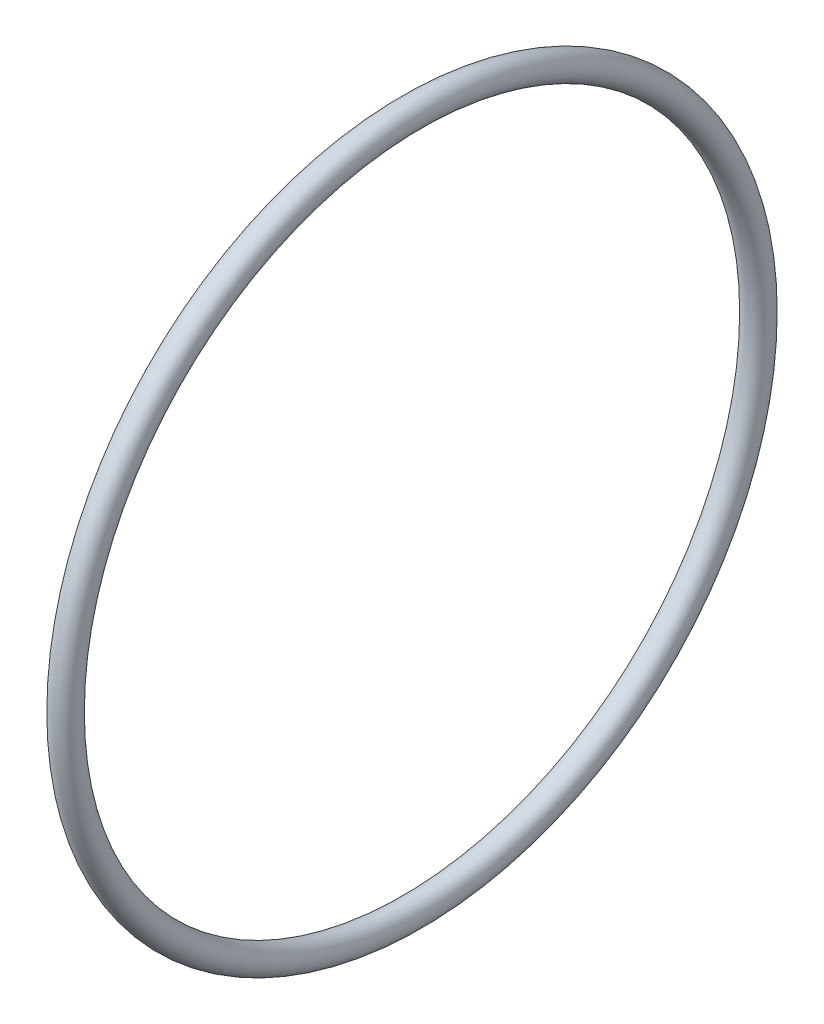
ISO-10303-21;
HEADER;
FILE_DESCRIPTION(('STEP AP214'),'2;1');
FILE_NAME('part.step','',(''),(''),'','','');
FILE_SCHEMA(('AUTOMOTIVE_DESIGN { 1 0 10303 214 1 1 1 1 }'));
ENDSEC;
DATA;
#1=APPLICATION_CONTEXT('core data for automotive mechanical design processes');
#2=APPLICATION_PROTOCOL_DEFINITION('international standard','automotive_design',2000,#1);
#3=PRODUCT_CONTEXT('',#1,'mechanical');
#4=PRODUCT('Part','Part','',(#3));
#5=PRODUCT_RELATED_PRODUCT_CATEGORY('part','',(#4));
#6=PRODUCT_DEFINITION_FORMATION('','',#4);
#7=PRODUCT_DEFINITION_CONTEXT('part definition',#1,'design');
#8=PRODUCT_DEFINITION('design','',#6,#7);
#9=PRODUCT_DEFINITION_SHAPE('','',#8);
#10=(LENGTH_UNIT() NAMED_UNIT(*) SI_UNIT(.MILLI.,.METRE.));
#11=(NAMED_UNIT(*) PLANE_ANGLE_UNIT() SI_UNIT($,.RADIAN.));
#12=(NAMED_UNIT(*) SI_UNIT($,.STERADIAN.) SOLID_ANGLE_UNIT());
#13=UNCERTAINTY_MEASURE_WITH_UNIT(LENGTH_MEASURE(1.E-05),#10,'distance_accuracy_value','');
#14=(GEOMETRIC_REPRESENTATION_CONTEXT(3) GLOBAL_UNCERTAINTY_ASSIGNED_CONTEXT((#13)) GLOBAL_UNIT_ASSIGNED_CONTEXT((#10,
#11,#12)) REPRESENTATION_CONTEXT('',''));
#15=CARTESIAN_POINT('',(0.,0.,0.));
#16=DIRECTION('',(0.,0.,1.));
#17=DIRECTION('',(1.,0.,0.));
#18=AXIS2_PLACEMENT_3D('',#15,#16,#17);
#19=CARTESIAN_POINT('',(0.,0.,0.));
#20=DIRECTION('',(1.,0.,0.));
#21=DIRECTION('',(0.,0.,-1.));
#22=AXIS2_PLACEMENT_3D('',#19,#20,#21);
#23=TOROIDAL_SURFACE('',#22,41.402,1.5875);
#24=CARTESIAN_POINT('',(0.,0.,-41.402));
#25=DIRECTION('',(0.,1.,0.));
#26=DIRECTION('',(0.,0.,1.));
#27=AXIS2_PLACEMENT_3D('',#24,#25,#26);
#28=CIRCLE('',#27,1.5875);
#29=CARTESIAN_POINT('',(0.,0.,-42.9895));
#30=VERTEX_POINT('',#29);
#31=EDGE_CURVE('E11',#30,#30,#28,.T.);
#32=CARTESIAN_POINT('',(0.,0.,0.));
#33=DIRECTION('',(1.,0.,0.));
#34=DIRECTION('',(0.,0.,-1.));
#35=AXIS2_PLACEMENT_3D('',#32,#33,#34);
#36=CIRCLE('',#35,42.9895);
#37=EDGE_CURVE('',#30,#30,#36,.T.);
#38=ORIENTED_EDGE('',*,*,#31,.T.);
#39=ORIENTED_EDGE('',*,*,#31,.F.);
#40=ORIENTED_EDGE('',*,*,#37,.T.);
#41=ORIENTED_EDGE('',*,*,#37,.F.);
#42=EDGE_LOOP('',(#38,#40,#39,#41));
#43=FACE_BOUND('',#42,.T.);
#44=ADVANCED_FACE('F43',(#43),#23,.T.);
#45=CLOSED_SHELL('',(#44));
#46=MANIFOLD_SOLID_BREP('B2',#45);
#47=ADVANCED_BREP_SHAPE_REPRESENTATION('',(#18,#46),#14);
#48=SHAPE_DEFINITION_REPRESENTATION(#9,#47);
ENDSEC;
END-ISO-10303-21;
